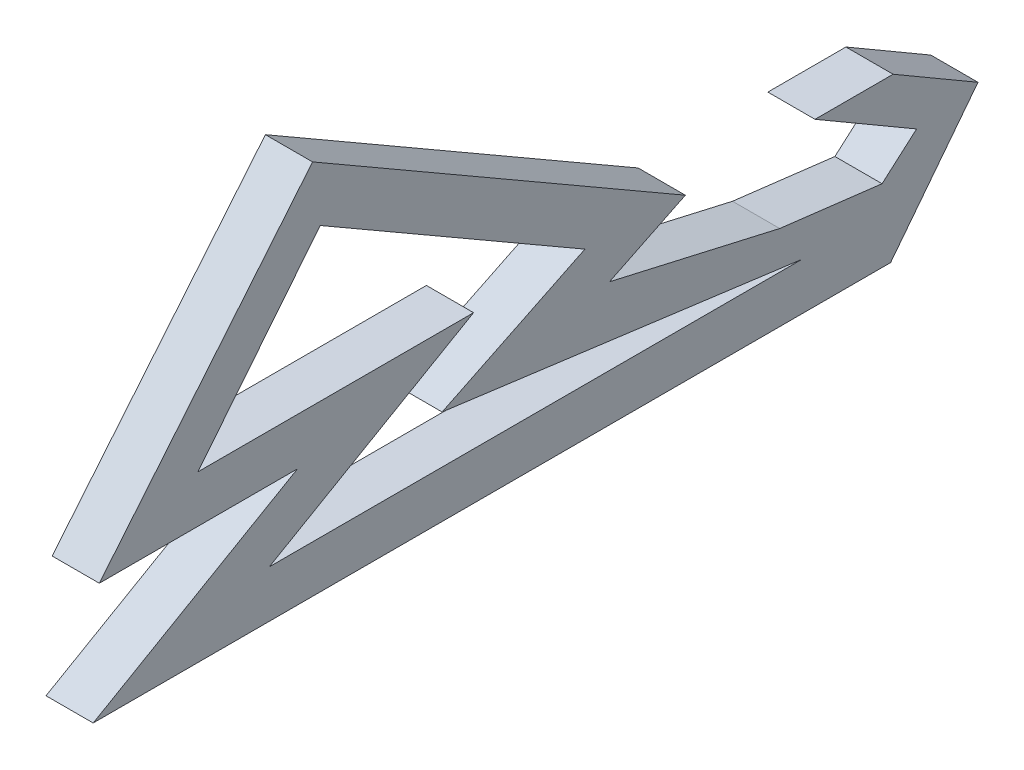
ISO-10303-21;
HEADER;
FILE_DESCRIPTION(('STEP AP214'),'2;1');
FILE_NAME('part.step','',(''),(''),'','','');
FILE_SCHEMA(('AUTOMOTIVE_DESIGN { 1 0 10303 214 1 1 1 1 }'));
ENDSEC;
DATA;
#1=APPLICATION_CONTEXT('core data for automotive mechanical design processes');
#2=APPLICATION_PROTOCOL_DEFINITION('international standard','automotive_design',2000,#1);
#3=PRODUCT_CONTEXT('',#1,'mechanical');
#4=PRODUCT('Part','Part','',(#3));
#5=PRODUCT_RELATED_PRODUCT_CATEGORY('part','',(#4));
#6=PRODUCT_DEFINITION_FORMATION('','',#4);
#7=PRODUCT_DEFINITION_CONTEXT('part definition',#1,'design');
#8=PRODUCT_DEFINITION('design','',#6,#7);
#9=PRODUCT_DEFINITION_SHAPE('','',#8);
#10=(LENGTH_UNIT() NAMED_UNIT(*) SI_UNIT(.MILLI.,.METRE.));
#11=(NAMED_UNIT(*) PLANE_ANGLE_UNIT() SI_UNIT($,.RADIAN.));
#12=(NAMED_UNIT(*) SI_UNIT($,.STERADIAN.) SOLID_ANGLE_UNIT());
#13=UNCERTAINTY_MEASURE_WITH_UNIT(LENGTH_MEASURE(1.E-05),#10,'distance_accuracy_value','');
#14=(GEOMETRIC_REPRESENTATION_CONTEXT(3) GLOBAL_UNCERTAINTY_ASSIGNED_CONTEXT((#13)) GLOBAL_UNIT_ASSIGNED_CONTEXT((#10,
#11,#12)) REPRESENTATION_CONTEXT('',''));
#15=CARTESIAN_POINT('',(0.,0.,0.));
#16=DIRECTION('',(0.,0.,1.));
#17=DIRECTION('',(1.,0.,0.));
#18=AXIS2_PLACEMENT_3D('',#15,#16,#17);
#19=CARTESIAN_POINT('',(10.,0.,0.));
#20=DIRECTION('',(1.,0.,0.));
#21=DIRECTION('',(0.,0.,-1.));
#22=AXIS2_PLACEMENT_3D('',#19,#20,#21);
#23=PLANE('',#22);
#24=DIRECTION('',(0.,0.789631512101993,-0.613581351652346));
#25=VECTOR('',#24,1.);
#26=CARTESIAN_POINT('',(10.,23.8373004705914,-103.02271954491));
#27=LINE('',#26,#25);
#28=CARTESIAN_POINT('',(10.,0.,-84.5));
#29=VERTEX_POINT('',#28);
#30=CARTESIAN_POINT('',(10.,23.8373004705914,-103.02271954491));
#31=VERTEX_POINT('',#30);
#32=EDGE_CURVE('E230',#29,#31,#27,.T.);
#33=ORIENTED_EDGE('',*,*,#32,.T.);
#34=DIRECTION('',(0.,0.503072019712805,0.864244492595746));
#35=VECTOR('',#34,1.);
#36=CARTESIAN_POINT('',(10.,34.3106128076045,-85.0302609071469));
#37=LINE('',#36,#35);
#38=CARTESIAN_POINT('',(10.,34.3106128076045,-85.0302609071469));
#39=VERTEX_POINT('',#38);
#40=EDGE_CURVE('E233',#31,#39,#37,.T.);
#41=ORIENTED_EDGE('',*,*,#40,.T.);
#42=DIRECTION('',(0.,0.,1.));
#43=VECTOR('',#42,1.);
#44=CARTESIAN_POINT('',(10.,34.3106128076045,-85.0302609071469));
#45=LINE('',#44,#43);
#46=CARTESIAN_POINT('',(10.,34.3106128076045,-68.4810560107661));
#47=VERTEX_POINT('',#46);
#48=EDGE_CURVE('E236',#39,#47,#45,.T.);
#49=ORIENTED_EDGE('',*,*,#48,.T.);
#50=DIRECTION('',(0.,-0.503072019712804,-0.864244492595747));
#51=VECTOR('',#50,1.);
#52=CARTESIAN_POINT('',(10.,34.3106128076045,-68.4810560107661));
#53=LINE('',#52,#51);
#54=CARTESIAN_POINT('',(10.,21.78077571705,-90.0064883033743));
#55=VERTEX_POINT('',#54);
#56=EDGE_CURVE('E238',#47,#55,#53,.T.);
#57=ORIENTED_EDGE('',*,*,#56,.T.);
#58=DIRECTION('',(0.,-0.658148149236437,0.752888447020309));
#59=VECTOR('',#58,1.);
#60=CARTESIAN_POINT('',(10.,21.78077571705,-90.0064883033743));
#61=LINE('',#60,#59);
#62=CARTESIAN_POINT('',(10.,15.3854212126879,-82.6905237648131));
#63=VERTEX_POINT('',#62);
#64=EDGE_CURVE('E240',#55,#63,#61,.T.);
#65=ORIENTED_EDGE('',*,*,#64,.T.);
#66=DIRECTION('',(0.,0.120335819353296,0.99273324240733));
#67=VECTOR('',#66,1.);
#68=CARTESIAN_POINT('',(10.,18.0147143849684,-60.9996693692971));
#69=LINE('',#68,#67);
#70=CARTESIAN_POINT('',(10.,18.0147143849684,-60.9996693692971));
#71=VERTEX_POINT('',#70);
#72=EDGE_CURVE('E242',#63,#71,#69,.T.);
#73=ORIENTED_EDGE('',*,*,#72,.T.);
#74=DIRECTION('',(0.,0.223094332787823,0.974796860211376));
#75=VECTOR('',#74,1.);
#76=CARTESIAN_POINT('',(10.,18.0147143849684,-60.9996693692971));
#77=LINE('',#76,#75);
#78=CARTESIAN_POINT('',(10.,26.2739495170874,-24.9114533490624));
#79=VERTEX_POINT('',#78);
#80=EDGE_CURVE('E244',#71,#79,#77,.T.);
#81=ORIENTED_EDGE('',*,*,#80,.T.);
#82=DIRECTION('',(0.,0.438371146789073,-0.898794046299169));
#83=VECTOR('',#82,1.);
#84=CARTESIAN_POINT('',(10.,34.1217782649971,-41.0018867789581));
#85=LINE('',#84,#83);
#86=CARTESIAN_POINT('',(10.,34.1217782649971,-41.0018867789581));
#87=VERTEX_POINT('',#86);
#88=EDGE_CURVE('E246',#79,#87,#85,.T.);
#89=ORIENTED_EDGE('',*,*,#88,.T.);
#90=DIRECTION('',(0.,0.499999999999995,0.866025403784441));
#91=VECTOR('',#90,1.);
#92=CARTESIAN_POINT('',(10.,79.736958130394,38.0059223443033));
#93=LINE('',#92,#91);
#94=CARTESIAN_POINT('',(10.,79.736958130394,38.0059223443033));
#95=VERTEX_POINT('',#94);
#96=EDGE_CURVE('E248',#87,#95,#93,.T.);
#97=ORIENTED_EDGE('',*,*,#96,.T.);
#98=DIRECTION('',(0.,-0.77113244194468,0.63667476546541));
#99=VECTOR('',#98,1.);
#100=CARTESIAN_POINT('',(10.,25.0000000000001,83.1987298107781));
#101=LINE('',#100,#99);
#102=CARTESIAN_POINT('',(10.,25.0000000000001,83.1987298107781));
#103=VERTEX_POINT('',#102);
#104=EDGE_CURVE('E250',#95,#103,#101,.T.);
#105=ORIENTED_EDGE('',*,*,#104,.T.);
#106=DIRECTION('',(0.,0.,-1.));
#107=VECTOR('',#106,1.);
#108=CARTESIAN_POINT('',(10.,25.0000000000001,41.1987298107781));
#109=LINE('',#108,#107);
#110=CARTESIAN_POINT('',(10.,25.0000000000001,41.1987298107781));
#111=VERTEX_POINT('',#110);
#112=EDGE_CURVE('E252',#103,#111,#109,.T.);
#113=ORIENTED_EDGE('',*,*,#112,.T.);
#114=DIRECTION('',(0.,-0.500000000000001,0.866025403784438));
#115=VECTOR('',#114,1.);
#116=CARTESIAN_POINT('',(10.,0.,84.5));
#117=LINE('',#116,#115);
#118=CARTESIAN_POINT('',(10.,0.,84.5));
#119=VERTEX_POINT('',#118);
#120=EDGE_CURVE('E254',#111,#119,#117,.T.);
#121=ORIENTED_EDGE('',*,*,#120,.T.);
#122=DIRECTION('',(0.,0.,-1.));
#123=VECTOR('',#122,1.);
#124=CARTESIAN_POINT('',(10.,0.,84.5));
#125=LINE('',#124,#123);
#126=EDGE_CURVE('E256',#119,#29,#125,.T.);
#127=ORIENTED_EDGE('',*,*,#126,.T.);
#128=EDGE_LOOP('',(#33,#41,#49,#57,#65,#73,#81,#89,#97,#105,#113,#121,#127));
#129=FACE_BOUND('',#128,.T.);
#130=DIRECTION('',(0.,0.,-1.));
#131=VECTOR('',#130,1.);
#132=CARTESIAN_POINT('',(10.,35.0000000000001,3.87822173508939));
#133=LINE('',#132,#131);
#134=CARTESIAN_POINT('',(10.,35.0000000000001,62.3149641217174));
#135=VERTEX_POINT('',#134);
#136=CARTESIAN_POINT('',(10.,35.0000000000001,3.87822173508939));
#137=VERTEX_POINT('',#136);
#138=EDGE_CURVE('E178',#135,#137,#133,.T.);
#139=ORIENTED_EDGE('',*,*,#138,.F.);
#140=DIRECTION('',(0.,-0.779417609929031,0.626504740071866));
#141=VECTOR('',#140,1.);
#142=CARTESIAN_POINT('',(10.,67.255588188146,36.3875554562658));
#143=LINE('',#142,#141);
#144=CARTESIAN_POINT('',(10.,67.255588188146,36.3875554562658));
#145=VERTEX_POINT('',#144);
#146=EDGE_CURVE('E170',#145,#135,#143,.T.);
#147=ORIENTED_EDGE('',*,*,#146,.F.);
#148=DIRECTION('',(0.,0.499999999999979,0.866025403784451));
#149=VECTOR('',#148,1.);
#150=CARTESIAN_POINT('',(10.,45.3792341135946,-1.50340128522269));
#151=LINE('',#150,#149);
#152=CARTESIAN_POINT('',(10.,34.8651565538835,-19.7143178133617));
#153=VERTEX_POINT('',#152);
#154=EDGE_CURVE('E202',#153,#145,#151,.T.);
#155=ORIENTED_EDGE('',*,*,#154,.F.);
#156=DIRECTION('',(0.,0.43837114678907,-0.89879404629917));
#157=VECTOR('',#156,1.);
#158=CARTESIAN_POINT('',(10.,20.1062917867779,10.5458393159866));
#159=LINE('',#158,#157);
#160=CARTESIAN_POINT('',(10.,20.1062917867779,10.5458393159866));
#161=VERTEX_POINT('',#160);
#162=EDGE_CURVE('E200',#161,#153,#159,.T.);
#163=ORIENTED_EDGE('',*,*,#162,.F.);
#164=DIRECTION('',(0.,0.131303866472987,0.991342168299747));
#165=VECTOR('',#164,1.);
#166=CARTESIAN_POINT('',(10.,20.1062917867779,10.5458393159866));
#167=LINE('',#166,#165);
#168=CARTESIAN_POINT('',(10.,9.99999999999999,-65.7565079224742));
#169=VERTEX_POINT('',#168);
#170=EDGE_CURVE('E198',#169,#161,#167,.T.);
#171=ORIENTED_EDGE('',*,*,#170,.F.);
#172=DIRECTION('',(0.,0.,-1.));
#173=VECTOR('',#172,1.);
#174=CARTESIAN_POINT('',(10.,10.,47.1794919243113));
#175=LINE('',#174,#173);
#176=CARTESIAN_POINT('',(10.,10.,47.1794919243113));
#177=VERTEX_POINT('',#176);
#178=EDGE_CURVE('E194',#177,#169,#175,.T.);
#179=ORIENTED_EDGE('',*,*,#178,.F.);
#180=DIRECTION('',(0.,-0.499999999999999,0.866025403784439));
#181=VECTOR('',#180,1.);
#182=CARTESIAN_POINT('',(10.,26.2739495170874,18.992184520905));
#183=LINE('',#182,#181);
#184=EDGE_CURVE('E192',#137,#177,#183,.T.);
#185=ORIENTED_EDGE('',*,*,#184,.F.);
#186=EDGE_LOOP('',(#139,#147,#155,#163,#171,#179,#185));
#187=FACE_BOUND('',#186,.T.);
#188=ADVANCED_FACE('F33',(#129,#187),#23,.T.);
#189=CARTESIAN_POINT('',(0.,0.,0.));
#190=DIRECTION('',(1.,0.,0.));
#191=DIRECTION('',(0.,0.,-1.));
#192=AXIS2_PLACEMENT_3D('',#189,#190,#191);
#193=PLANE('',#192);
#194=DIRECTION('',(0.,0.789631512101993,-0.613581351652346));
#195=VECTOR('',#194,1.);
#196=CARTESIAN_POINT('',(0.,23.8373004705914,-103.02271954491));
#197=LINE('',#196,#195);
#198=CARTESIAN_POINT('',(0.,0.,-84.5));
#199=VERTEX_POINT('',#198);
#200=CARTESIAN_POINT('',(0.,23.8373004705914,-103.02271954491));
#201=VERTEX_POINT('',#200);
#202=EDGE_CURVE('E187',#199,#201,#197,.T.);
#203=ORIENTED_EDGE('',*,*,#202,.F.);
#204=DIRECTION('',(0.,0.,-1.));
#205=VECTOR('',#204,1.);
#206=CARTESIAN_POINT('',(0.,0.,84.5));
#207=LINE('',#206,#205);
#208=CARTESIAN_POINT('',(0.,0.,84.5));
#209=VERTEX_POINT('',#208);
#210=EDGE_CURVE('E234',#209,#199,#207,.T.);
#211=ORIENTED_EDGE('',*,*,#210,.F.);
#212=DIRECTION('',(0.,-0.500000000000001,0.866025403784438));
#213=VECTOR('',#212,1.);
#214=CARTESIAN_POINT('',(0.,0.,84.5));
#215=LINE('',#214,#213);
#216=CARTESIAN_POINT('',(0.,25.0000000000001,41.1987298107781));
#217=VERTEX_POINT('',#216);
#218=EDGE_CURVE('E281',#217,#209,#215,.T.);
#219=ORIENTED_EDGE('',*,*,#218,.F.);
#220=DIRECTION('',(0.,0.,-1.));
#221=VECTOR('',#220,1.);
#222=CARTESIAN_POINT('',(0.,25.0000000000001,41.1987298107781));
#223=LINE('',#222,#221);
#224=CARTESIAN_POINT('',(0.,25.0000000000001,83.1987298107781));
#225=VERTEX_POINT('',#224);
#226=EDGE_CURVE('E279',#225,#217,#223,.T.);
#227=ORIENTED_EDGE('',*,*,#226,.F.);
#228=DIRECTION('',(0.,-0.77113244194468,0.63667476546541));
#229=VECTOR('',#228,1.);
#230=CARTESIAN_POINT('',(0.,25.0000000000001,83.1987298107781));
#231=LINE('',#230,#229);
#232=CARTESIAN_POINT('',(0.,79.736958130394,38.0059223443033));
#233=VERTEX_POINT('',#232);
#234=EDGE_CURVE('E277',#233,#225,#231,.T.);
#235=ORIENTED_EDGE('',*,*,#234,.F.);
#236=DIRECTION('',(0.,0.499999999999995,0.866025403784441));
#237=VECTOR('',#236,1.);
#238=CARTESIAN_POINT('',(0.,79.736958130394,38.0059223443033));
#239=LINE('',#238,#237);
#240=CARTESIAN_POINT('',(0.,34.1217782649971,-41.0018867789581));
#241=VERTEX_POINT('',#240);
#242=EDGE_CURVE('E275',#241,#233,#239,.T.);
#243=ORIENTED_EDGE('',*,*,#242,.F.);
#244=DIRECTION('',(0.,0.438371146789073,-0.898794046299169));
#245=VECTOR('',#244,1.);
#246=CARTESIAN_POINT('',(0.,34.1217782649971,-41.0018867789581));
#247=LINE('',#246,#245);
#248=CARTESIAN_POINT('',(0.,26.2739495170874,-24.9114533490624));
#249=VERTEX_POINT('',#248);
#250=EDGE_CURVE('E273',#249,#241,#247,.T.);
#251=ORIENTED_EDGE('',*,*,#250,.F.);
#252=DIRECTION('',(0.,0.223094332787823,0.974796860211376));
#253=VECTOR('',#252,1.);
#254=CARTESIAN_POINT('',(0.,18.0147143849684,-60.9996693692971));
#255=LINE('',#254,#253);
#256=CARTESIAN_POINT('',(0.,18.0147143849684,-60.9996693692971));
#257=VERTEX_POINT('',#256);
#258=EDGE_CURVE('E271',#257,#249,#255,.T.);
#259=ORIENTED_EDGE('',*,*,#258,.F.);
#260=DIRECTION('',(0.,0.120335819353296,0.99273324240733));
#261=VECTOR('',#260,1.);
#262=CARTESIAN_POINT('',(0.,18.0147143849684,-60.9996693692971));
#263=LINE('',#262,#261);
#264=CARTESIAN_POINT('',(0.,15.3854212126879,-82.6905237648131));
#265=VERTEX_POINT('',#264);
#266=EDGE_CURVE('E269',#265,#257,#263,.T.);
#267=ORIENTED_EDGE('',*,*,#266,.F.);
#268=DIRECTION('',(0.,-0.658148149236437,0.752888447020309));
#269=VECTOR('',#268,1.);
#270=CARTESIAN_POINT('',(0.,21.78077571705,-90.0064883033743));
#271=LINE('',#270,#269);
#272=CARTESIAN_POINT('',(0.,21.78077571705,-90.0064883033743));
#273=VERTEX_POINT('',#272);
#274=EDGE_CURVE('E267',#273,#265,#271,.T.);
#275=ORIENTED_EDGE('',*,*,#274,.F.);
#276=DIRECTION('',(0.,-0.503072019712804,-0.864244492595747));
#277=VECTOR('',#276,1.);
#278=CARTESIAN_POINT('',(0.,34.3106128076045,-68.4810560107661));
#279=LINE('',#278,#277);
#280=CARTESIAN_POINT('',(0.,34.3106128076045,-68.4810560107661));
#281=VERTEX_POINT('',#280);
#282=EDGE_CURVE('E265',#281,#273,#279,.T.);
#283=ORIENTED_EDGE('',*,*,#282,.F.);
#284=DIRECTION('',(0.,0.,1.));
#285=VECTOR('',#284,1.);
#286=CARTESIAN_POINT('',(0.,34.3106128076045,-85.0302609071469));
#287=LINE('',#286,#285);
#288=CARTESIAN_POINT('',(0.,34.3106128076045,-85.0302609071469));
#289=VERTEX_POINT('',#288);
#290=EDGE_CURVE('E263',#289,#281,#287,.T.);
#291=ORIENTED_EDGE('',*,*,#290,.F.);
#292=DIRECTION('',(0.,0.503072019712805,0.864244492595746));
#293=VECTOR('',#292,1.);
#294=CARTESIAN_POINT('',(0.,34.3106128076045,-85.0302609071469));
#295=LINE('',#294,#293);
#296=EDGE_CURVE('E261',#201,#289,#295,.T.);
#297=ORIENTED_EDGE('',*,*,#296,.F.);
#298=EDGE_LOOP('',(#203,#211,#219,#227,#235,#243,#251,#259,#267,#275,#283,#291,#297));
#299=FACE_BOUND('',#298,.T.);
#300=DIRECTION('',(0.,-0.779417609929031,0.626504740071866));
#301=VECTOR('',#300,1.);
#302=CARTESIAN_POINT('',(0.,67.255588188146,36.3875554562658));
#303=LINE('',#302,#301);
#304=CARTESIAN_POINT('',(0.,67.255588188146,36.3875554562658));
#305=VERTEX_POINT('',#304);
#306=CARTESIAN_POINT('',(0.,35.0000000000001,62.3149641217174));
#307=VERTEX_POINT('',#306);
#308=EDGE_CURVE('E56',#305,#307,#303,.T.);
#309=ORIENTED_EDGE('',*,*,#308,.T.);
#310=DIRECTION('',(0.,0.,-1.));
#311=VECTOR('',#310,1.);
#312=CARTESIAN_POINT('',(0.,35.0000000000001,3.87822173508939));
#313=LINE('',#312,#311);
#314=CARTESIAN_POINT('',(0.,35.0000000000001,3.87822173508939));
#315=VERTEX_POINT('',#314);
#316=EDGE_CURVE('E186',#307,#315,#313,.T.);
#317=ORIENTED_EDGE('',*,*,#316,.T.);
#318=DIRECTION('',(0.,-0.500000000000002,0.866025403784438));
#319=VECTOR('',#318,1.);
#320=CARTESIAN_POINT('',(0.,10.,47.1794919243113));
#321=LINE('',#320,#319);
#322=CARTESIAN_POINT('',(0.,10.,47.1794919243113));
#323=VERTEX_POINT('',#322);
#324=EDGE_CURVE('E206',#315,#323,#321,.T.);
#325=ORIENTED_EDGE('',*,*,#324,.T.);
#326=DIRECTION('',(0.,0.,-1.));
#327=VECTOR('',#326,1.);
#328=CARTESIAN_POINT('',(0.,9.99999999999999,-65.7565079224742));
#329=LINE('',#328,#327);
#330=CARTESIAN_POINT('',(0.,9.99999999999999,-65.7565079224742));
#331=VERTEX_POINT('',#330);
#332=EDGE_CURVE('E209',#323,#331,#329,.T.);
#333=ORIENTED_EDGE('',*,*,#332,.T.);
#334=DIRECTION('',(0.,0.131303866472987,0.991342168299747));
#335=VECTOR('',#334,1.);
#336=CARTESIAN_POINT('',(0.,20.1062917867779,10.5458393159866));
#337=LINE('',#336,#335);
#338=CARTESIAN_POINT('',(0.,20.1062917867779,10.5458393159866));
#339=VERTEX_POINT('',#338);
#340=EDGE_CURVE('E212',#331,#339,#337,.T.);
#341=ORIENTED_EDGE('',*,*,#340,.T.);
#342=DIRECTION('',(0.,0.43837114678907,-0.89879404629917));
#343=VECTOR('',#342,1.);
#344=CARTESIAN_POINT('',(0.,20.1062917867779,10.5458393159866));
#345=LINE('',#344,#343);
#346=CARTESIAN_POINT('',(0.,34.8651565538844,-19.7143178133617));
#347=VERTEX_POINT('',#346);
#348=EDGE_CURVE('E215',#339,#347,#345,.T.);
#349=ORIENTED_EDGE('',*,*,#348,.T.);
#350=DIRECTION('',(0.,0.50000000000001,0.866025403784433));
#351=VECTOR('',#350,1.);
#352=CARTESIAN_POINT('',(0.,45.3792341135946,-1.50340128522269));
#353=LINE('',#352,#351);
#354=EDGE_CURVE('E179',#347,#305,#353,.T.);
#355=ORIENTED_EDGE('',*,*,#354,.T.);
#356=EDGE_LOOP('',(#309,#317,#325,#333,#341,#349,#355));
#357=FACE_BOUND('',#356,.T.);
#358=ADVANCED_FACE('F326',(#299,#357),#193,.F.);
#359=CARTESIAN_POINT('',(10.,23.8373004705914,-103.02271954491));
#360=DIRECTION('',(0.,0.613581351652346,0.789631512101993));
#361=DIRECTION('',(0.,-0.789631512101993,0.613581351652346));
#362=AXIS2_PLACEMENT_3D('',#359,#360,#361);
#363=PLANE('',#362);
#364=ORIENTED_EDGE('',*,*,#202,.T.);
#365=DIRECTION('',(-1.,0.,0.));
#366=VECTOR('',#365,1.);
#367=CARTESIAN_POINT('',(10.,23.8373004705914,-103.02271954491));
#368=LINE('',#367,#366);
#369=EDGE_CURVE('E11',#31,#201,#368,.T.);
#370=ORIENTED_EDGE('',*,*,#369,.F.);
#371=ORIENTED_EDGE('',*,*,#32,.F.);
#372=DIRECTION('',(-1.,0.,0.));
#373=VECTOR('',#372,1.);
#374=CARTESIAN_POINT('',(10.,0.,-84.5));
#375=LINE('',#374,#373);
#376=EDGE_CURVE('E258',#29,#199,#375,.T.);
#377=ORIENTED_EDGE('',*,*,#376,.T.);
#378=EDGE_LOOP('',(#364,#370,#371,#377));
#379=FACE_BOUND('',#378,.T.);
#380=ADVANCED_FACE('F35',(#379),#363,.F.);
#381=CARTESIAN_POINT('',(10.,34.3106128076045,-85.0302609071469));
#382=DIRECTION('',(0.,-0.864244492595746,0.503072019712805));
#383=DIRECTION('',(0.,-0.503072019712805,-0.864244492595746));
#384=AXIS2_PLACEMENT_3D('',#381,#382,#383);
#385=PLANE('',#384);
#386=ORIENTED_EDGE('',*,*,#296,.T.);
#387=DIRECTION('',(-1.,0.,0.));
#388=VECTOR('',#387,1.);
#389=CARTESIAN_POINT('',(10.,34.3106128076045,-85.0302609071469));
#390=LINE('',#389,#388);
#391=EDGE_CURVE('E41',#39,#289,#390,.T.);
#392=ORIENTED_EDGE('',*,*,#391,.F.);
#393=ORIENTED_EDGE('',*,*,#40,.F.);
#394=ORIENTED_EDGE('',*,*,#369,.T.);
#395=EDGE_LOOP('',(#386,#392,#393,#394));
#396=FACE_BOUND('',#395,.T.);
#397=ADVANCED_FACE('F343',(#396),#385,.F.);
#398=CARTESIAN_POINT('',(10.,34.3106128076045,-85.0302609071469));
#399=DIRECTION('',(0.,-1.,0.));
#400=DIRECTION('',(0.,0.,-1.));
#401=AXIS2_PLACEMENT_3D('',#398,#399,#400);
#402=PLANE('',#401);
#403=ORIENTED_EDGE('',*,*,#290,.T.);
#404=DIRECTION('',(-1.,0.,0.));
#405=VECTOR('',#404,1.);
#406=CARTESIAN_POINT('',(10.,34.3106128076045,-68.4810560107661));
#407=LINE('',#406,#405);
#408=EDGE_CURVE('E313',#47,#281,#407,.T.);
#409=ORIENTED_EDGE('',*,*,#408,.F.);
#410=ORIENTED_EDGE('',*,*,#48,.F.);
#411=ORIENTED_EDGE('',*,*,#391,.T.);
#412=EDGE_LOOP('',(#403,#409,#410,#411));
#413=FACE_BOUND('',#412,.T.);
#414=ADVANCED_FACE('F320',(#413),#402,.F.);
#415=CARTESIAN_POINT('',(10.,34.3106128076045,-68.4810560107661));
#416=DIRECTION('',(0.,0.864244492595747,-0.503072019712804));
#417=DIRECTION('',(0.,0.503072019712804,0.864244492595747));
#418=AXIS2_PLACEMENT_3D('',#415,#416,#417);
#419=PLANE('',#418);
#420=ORIENTED_EDGE('',*,*,#282,.T.);
#421=DIRECTION('',(-1.,0.,0.));
#422=VECTOR('',#421,1.);
#423=CARTESIAN_POINT('',(10.,21.78077571705,-90.0064883033743));
#424=LINE('',#423,#422);
#425=EDGE_CURVE('E310',#55,#273,#424,.T.);
#426=ORIENTED_EDGE('',*,*,#425,.F.);
#427=ORIENTED_EDGE('',*,*,#56,.F.);
#428=ORIENTED_EDGE('',*,*,#408,.T.);
#429=EDGE_LOOP('',(#420,#426,#427,#428));
#430=FACE_BOUND('',#429,.T.);
#431=ADVANCED_FACE('F332',(#430),#419,.F.);
#432=CARTESIAN_POINT('',(10.,21.78077571705,-90.0064883033743));
#433=DIRECTION('',(0.,-0.752888447020309,-0.658148149236437));
#434=DIRECTION('',(0.,0.658148149236437,-0.752888447020309));
#435=AXIS2_PLACEMENT_3D('',#432,#433,#434);
#436=PLANE('',#435);
#437=ORIENTED_EDGE('',*,*,#274,.T.);
#438=DIRECTION('',(-1.,0.,0.));
#439=VECTOR('',#438,1.);
#440=CARTESIAN_POINT('',(10.,15.3854212126879,-82.6905237648131));
#441=LINE('',#440,#439);
#442=EDGE_CURVE('E307',#63,#265,#441,.T.);
#443=ORIENTED_EDGE('',*,*,#442,.F.);
#444=ORIENTED_EDGE('',*,*,#64,.F.);
#445=ORIENTED_EDGE('',*,*,#425,.T.);
#446=EDGE_LOOP('',(#437,#443,#444,#445));
#447=FACE_BOUND('',#446,.T.);
#448=ADVANCED_FACE('F336',(#447),#436,.F.);
#449=CARTESIAN_POINT('',(10.,18.0147143849684,-60.9996693692971));
#450=DIRECTION('',(0.,-0.99273324240733,0.120335819353296));
#451=DIRECTION('',(0.,-0.120335819353296,-0.99273324240733));
#452=AXIS2_PLACEMENT_3D('',#449,#450,#451);
#453=PLANE('',#452);
#454=ORIENTED_EDGE('',*,*,#266,.T.);
#455=DIRECTION('',(-1.,0.,0.));
#456=VECTOR('',#455,1.);
#457=CARTESIAN_POINT('',(10.,18.0147143849684,-60.9996693692971));
#458=LINE('',#457,#456);
#459=EDGE_CURVE('E304',#71,#257,#458,.T.);
#460=ORIENTED_EDGE('',*,*,#459,.F.);
#461=ORIENTED_EDGE('',*,*,#72,.F.);
#462=ORIENTED_EDGE('',*,*,#442,.T.);
#463=EDGE_LOOP('',(#454,#460,#461,#462));
#464=FACE_BOUND('',#463,.T.);
#465=ADVANCED_FACE('F381',(#464),#453,.F.);
#466=CARTESIAN_POINT('',(10.,18.0147143849684,-60.9996693692971));
#467=DIRECTION('',(0.,-0.974796860211376,0.223094332787823));
#468=DIRECTION('',(0.,-0.223094332787823,-0.974796860211376));
#469=AXIS2_PLACEMENT_3D('',#466,#467,#468);
#470=PLANE('',#469);
#471=ORIENTED_EDGE('',*,*,#258,.T.);
#472=DIRECTION('',(-1.,0.,0.));
#473=VECTOR('',#472,1.);
#474=CARTESIAN_POINT('',(10.,26.2739495170874,-24.9114533490624));
#475=LINE('',#474,#473);
#476=EDGE_CURVE('E301',#79,#249,#475,.T.);
#477=ORIENTED_EDGE('',*,*,#476,.F.);
#478=ORIENTED_EDGE('',*,*,#80,.F.);
#479=ORIENTED_EDGE('',*,*,#459,.T.);
#480=EDGE_LOOP('',(#471,#477,#478,#479));
#481=FACE_BOUND('',#480,.T.);
#482=ADVANCED_FACE('F378',(#481),#470,.F.);
#483=CARTESIAN_POINT('',(10.,34.1217782649971,-41.0018867789581));
#484=DIRECTION('',(0.,0.898794046299169,0.438371146789073));
#485=DIRECTION('',(0.,-0.438371146789073,0.898794046299169));
#486=AXIS2_PLACEMENT_3D('',#483,#484,#485);
#487=PLANE('',#486);
#488=ORIENTED_EDGE('',*,*,#250,.T.);
#489=DIRECTION('',(-1.,0.,0.));
#490=VECTOR('',#489,1.);
#491=CARTESIAN_POINT('',(10.,34.1217782649971,-41.0018867789581));
#492=LINE('',#491,#490);
#493=EDGE_CURVE('E298',#87,#241,#492,.T.);
#494=ORIENTED_EDGE('',*,*,#493,.F.);
#495=ORIENTED_EDGE('',*,*,#88,.F.);
#496=ORIENTED_EDGE('',*,*,#476,.T.);
#497=EDGE_LOOP('',(#488,#494,#495,#496));
#498=FACE_BOUND('',#497,.T.);
#499=ADVANCED_FACE('F374',(#498),#487,.F.);
#500=CARTESIAN_POINT('',(10.,79.736958130394,38.0059223443033));
#501=DIRECTION('',(0.,-0.866025403784441,0.499999999999995));
#502=DIRECTION('',(0.,-0.499999999999995,-0.866025403784441));
#503=AXIS2_PLACEMENT_3D('',#500,#501,#502);
#504=PLANE('',#503);
#505=ORIENTED_EDGE('',*,*,#242,.T.);
#506=DIRECTION('',(-1.,0.,0.));
#507=VECTOR('',#506,1.);
#508=CARTESIAN_POINT('',(10.,79.736958130394,38.0059223443033));
#509=LINE('',#508,#507);
#510=EDGE_CURVE('E295',#95,#233,#509,.T.);
#511=ORIENTED_EDGE('',*,*,#510,.F.);
#512=ORIENTED_EDGE('',*,*,#96,.F.);
#513=ORIENTED_EDGE('',*,*,#493,.T.);
#514=EDGE_LOOP('',(#505,#511,#512,#513));
#515=FACE_BOUND('',#514,.T.);
#516=ADVANCED_FACE('F370',(#515),#504,.F.);
#517=CARTESIAN_POINT('',(10.,25.0000000000001,83.1987298107781));
#518=DIRECTION('',(0.,-0.63667476546541,-0.77113244194468));
#519=DIRECTION('',(0.,0.77113244194468,-0.63667476546541));
#520=AXIS2_PLACEMENT_3D('',#517,#518,#519);
#521=PLANE('',#520);
#522=ORIENTED_EDGE('',*,*,#234,.T.);
#523=DIRECTION('',(-1.,0.,0.));
#524=VECTOR('',#523,1.);
#525=CARTESIAN_POINT('',(10.,25.0000000000001,83.1987298107781));
#526=LINE('',#525,#524);
#527=EDGE_CURVE('E292',#103,#225,#526,.T.);
#528=ORIENTED_EDGE('',*,*,#527,.F.);
#529=ORIENTED_EDGE('',*,*,#104,.F.);
#530=ORIENTED_EDGE('',*,*,#510,.T.);
#531=EDGE_LOOP('',(#522,#528,#529,#530));
#532=FACE_BOUND('',#531,.T.);
#533=ADVANCED_FACE('F365',(#532),#521,.F.);
#534=CARTESIAN_POINT('',(10.,25.0000000000001,41.1987298107781));
#535=DIRECTION('',(0.,1.,0.));
#536=DIRECTION('',(0.,0.,1.));
#537=AXIS2_PLACEMENT_3D('',#534,#535,#536);
#538=PLANE('',#537);
#539=ORIENTED_EDGE('',*,*,#226,.T.);
#540=DIRECTION('',(-1.,0.,0.));
#541=VECTOR('',#540,1.);
#542=CARTESIAN_POINT('',(10.,25.0000000000001,41.1987298107781));
#543=LINE('',#542,#541);
#544=EDGE_CURVE('E289',#111,#217,#543,.T.);
#545=ORIENTED_EDGE('',*,*,#544,.F.);
#546=ORIENTED_EDGE('',*,*,#112,.F.);
#547=ORIENTED_EDGE('',*,*,#527,.T.);
#548=EDGE_LOOP('',(#539,#545,#546,#547));
#549=FACE_BOUND('',#548,.T.);
#550=ADVANCED_FACE('F359',(#549),#538,.F.);
#551=CARTESIAN_POINT('',(10.,0.,84.5));
#552=DIRECTION('',(0.,-0.866025403784438,-0.500000000000001));
#553=DIRECTION('',(0.,0.500000000000001,-0.866025403784438));
#554=AXIS2_PLACEMENT_3D('',#551,#552,#553);
#555=PLANE('',#554);
#556=ORIENTED_EDGE('',*,*,#218,.T.);
#557=DIRECTION('',(-1.,0.,0.));
#558=VECTOR('',#557,1.);
#559=CARTESIAN_POINT('',(10.,0.,84.5));
#560=LINE('',#559,#558);
#561=EDGE_CURVE('E286',#119,#209,#560,.T.);
#562=ORIENTED_EDGE('',*,*,#561,.F.);
#563=ORIENTED_EDGE('',*,*,#120,.F.);
#564=ORIENTED_EDGE('',*,*,#544,.T.);
#565=EDGE_LOOP('',(#556,#562,#563,#564));
#566=FACE_BOUND('',#565,.T.);
#567=ADVANCED_FACE('F355',(#566),#555,.F.);
#568=CARTESIAN_POINT('',(10.,0.,84.5));
#569=DIRECTION('',(0.,1.,0.));
#570=DIRECTION('',(0.,0.,1.));
#571=AXIS2_PLACEMENT_3D('',#568,#569,#570);
#572=PLANE('',#571);
#573=ORIENTED_EDGE('',*,*,#210,.T.);
#574=ORIENTED_EDGE('',*,*,#376,.F.);
#575=ORIENTED_EDGE('',*,*,#126,.F.);
#576=ORIENTED_EDGE('',*,*,#561,.T.);
#577=EDGE_LOOP('',(#573,#574,#575,#576));
#578=FACE_BOUND('',#577,.T.);
#579=ADVANCED_FACE('F350',(#578),#572,.F.);
#580=CARTESIAN_POINT('',(10.,67.255588188146,36.3875554562658));
#581=DIRECTION('',(0.,-0.626504740071866,-0.779417609929031));
#582=DIRECTION('',(0.,0.779417609929031,-0.626504740071866));
#583=AXIS2_PLACEMENT_3D('',#580,#581,#582);
#584=PLANE('',#583);
#585=ORIENTED_EDGE('',*,*,#308,.F.);
#586=DIRECTION('',(-1.,0.,0.));
#587=VECTOR('',#586,1.);
#588=CARTESIAN_POINT('',(10.,67.255588188146,36.3875554562658));
#589=LINE('',#588,#587);
#590=EDGE_CURVE('E174',#145,#305,#589,.T.);
#591=ORIENTED_EDGE('',*,*,#590,.F.);
#592=ORIENTED_EDGE('',*,*,#146,.T.);
#593=DIRECTION('',(-1.,0.,0.));
#594=VECTOR('',#593,1.);
#595=CARTESIAN_POINT('',(10.,35.0000000000001,62.3149641217174));
#596=LINE('',#595,#594);
#597=EDGE_CURVE('E173',#135,#307,#596,.T.);
#598=ORIENTED_EDGE('',*,*,#597,.T.);
#599=EDGE_LOOP('',(#585,#591,#592,#598));
#600=FACE_BOUND('',#599,.T.);
#601=ADVANCED_FACE('F172',(#600),#584,.T.);
#602=CARTESIAN_POINT('',(10.,35.0000000000001,3.87822173508939));
#603=DIRECTION('',(0.,1.,0.));
#604=DIRECTION('',(0.,0.,1.));
#605=AXIS2_PLACEMENT_3D('',#602,#603,#604);
#606=PLANE('',#605);
#607=ORIENTED_EDGE('',*,*,#316,.F.);
#608=ORIENTED_EDGE('',*,*,#597,.F.);
#609=ORIENTED_EDGE('',*,*,#138,.T.);
#610=DIRECTION('',(-1.,0.,0.));
#611=VECTOR('',#610,1.);
#612=CARTESIAN_POINT('',(10.,35.0000000000001,3.87822173508939));
#613=LINE('',#612,#611);
#614=EDGE_CURVE('E188',#137,#315,#613,.T.);
#615=ORIENTED_EDGE('',*,*,#614,.T.);
#616=EDGE_LOOP('',(#607,#608,#609,#615));
#617=FACE_BOUND('',#616,.T.);
#618=ADVANCED_FACE('F182',(#617),#606,.T.);
#619=CARTESIAN_POINT('',(10.,10.,47.1794919243113));
#620=DIRECTION('',(0.,-0.866025403784438,-0.500000000000002));
#621=DIRECTION('',(0.,0.500000000000002,-0.866025403784438));
#622=AXIS2_PLACEMENT_3D('',#619,#620,#621);
#623=PLANE('',#622);
#624=ORIENTED_EDGE('',*,*,#324,.F.);
#625=ORIENTED_EDGE('',*,*,#614,.F.);
#626=ORIENTED_EDGE('',*,*,#184,.T.);
#627=DIRECTION('',(-1.,0.,0.));
#628=VECTOR('',#627,1.);
#629=CARTESIAN_POINT('',(10.,10.,47.1794919243113));
#630=LINE('',#629,#628);
#631=EDGE_CURVE('E226',#177,#323,#630,.T.);
#632=ORIENTED_EDGE('',*,*,#631,.T.);
#633=EDGE_LOOP('',(#624,#625,#626,#632));
#634=FACE_BOUND('',#633,.T.);
#635=ADVANCED_FACE('F445',(#634),#623,.T.);
#636=CARTESIAN_POINT('',(10.,9.99999999999999,-65.7565079224742));
#637=DIRECTION('',(0.,1.,0.));
#638=DIRECTION('',(0.,0.,1.));
#639=AXIS2_PLACEMENT_3D('',#636,#637,#638);
#640=PLANE('',#639);
#641=ORIENTED_EDGE('',*,*,#332,.F.);
#642=ORIENTED_EDGE('',*,*,#631,.F.);
#643=ORIENTED_EDGE('',*,*,#178,.T.);
#644=DIRECTION('',(-1.,0.,0.));
#645=VECTOR('',#644,1.);
#646=CARTESIAN_POINT('',(10.,9.99999999999999,-65.7565079224742));
#647=LINE('',#646,#645);
#648=EDGE_CURVE('E224',#169,#331,#647,.T.);
#649=ORIENTED_EDGE('',*,*,#648,.T.);
#650=EDGE_LOOP('',(#641,#642,#643,#649));
#651=FACE_BOUND('',#650,.T.);
#652=ADVANCED_FACE('F451',(#651),#640,.T.);
#653=CARTESIAN_POINT('',(10.,20.1062917867779,10.5458393159866));
#654=DIRECTION('',(0.,-0.991342168299747,0.131303866472987));
#655=DIRECTION('',(0.,-0.131303866472987,-0.991342168299747));
#656=AXIS2_PLACEMENT_3D('',#653,#654,#655);
#657=PLANE('',#656);
#658=ORIENTED_EDGE('',*,*,#340,.F.);
#659=ORIENTED_EDGE('',*,*,#648,.F.);
#660=ORIENTED_EDGE('',*,*,#170,.T.);
#661=DIRECTION('',(-1.,0.,0.));
#662=VECTOR('',#661,1.);
#663=CARTESIAN_POINT('',(10.,20.1062917867779,10.5458393159866));
#664=LINE('',#663,#662);
#665=EDGE_CURVE('E222',#161,#339,#664,.T.);
#666=ORIENTED_EDGE('',*,*,#665,.T.);
#667=EDGE_LOOP('',(#658,#659,#660,#666));
#668=FACE_BOUND('',#667,.T.);
#669=ADVANCED_FACE('F459',(#668),#657,.T.);
#670=CARTESIAN_POINT('',(10.,20.1062917867779,10.5458393159866));
#671=DIRECTION('',(0.,0.898794046299171,0.43837114678907));
#672=DIRECTION('',(0.,-0.43837114678907,0.898794046299171));
#673=AXIS2_PLACEMENT_3D('',#670,#671,#672);
#674=PLANE('',#673);
#675=ORIENTED_EDGE('',*,*,#348,.F.);
#676=ORIENTED_EDGE('',*,*,#665,.F.);
#677=ORIENTED_EDGE('',*,*,#162,.T.);
#678=DIRECTION('',(-1.,0.,0.));
#679=VECTOR('',#678,1.);
#680=CARTESIAN_POINT('',(10.,34.8651565538844,-19.7143178133617));
#681=LINE('',#680,#679);
#682=EDGE_CURVE('E48',#153,#347,#681,.T.);
#683=ORIENTED_EDGE('',*,*,#682,.T.);
#684=EDGE_LOOP('',(#675,#676,#677,#683));
#685=FACE_BOUND('',#684,.T.);
#686=ADVANCED_FACE('F467',(#685),#674,.T.);
#687=CARTESIAN_POINT('',(10.,45.3792341135946,-1.50340128522269));
#688=DIRECTION('',(0.,-0.866025403784433,0.50000000000001));
#689=DIRECTION('',(0.,-0.50000000000001,-0.866025403784433));
#690=AXIS2_PLACEMENT_3D('',#687,#688,#689);
#691=PLANE('',#690);
#692=ORIENTED_EDGE('',*,*,#354,.F.);
#693=ORIENTED_EDGE('',*,*,#682,.F.);
#694=ORIENTED_EDGE('',*,*,#154,.T.);
#695=ORIENTED_EDGE('',*,*,#590,.T.);
#696=EDGE_LOOP('',(#692,#693,#694,#695));
#697=FACE_BOUND('',#696,.T.);
#698=ADVANCED_FACE('F475',(#697),#691,.T.);
#699=CLOSED_SHELL('',(#188,#358,#380,#397,#414,#431,#448,#465,#482,#499,#516,#533,#550,#567,
#579,#601,#618,#635,#652,#669,#686,#698));
#700=MANIFOLD_SOLID_BREP('B2',#699);
#701=ADVANCED_BREP_SHAPE_REPRESENTATION('',(#18,#700),#14);
#702=SHAPE_DEFINITION_REPRESENTATION(#9,#701);
ENDSEC;
END-ISO-10303-21;
